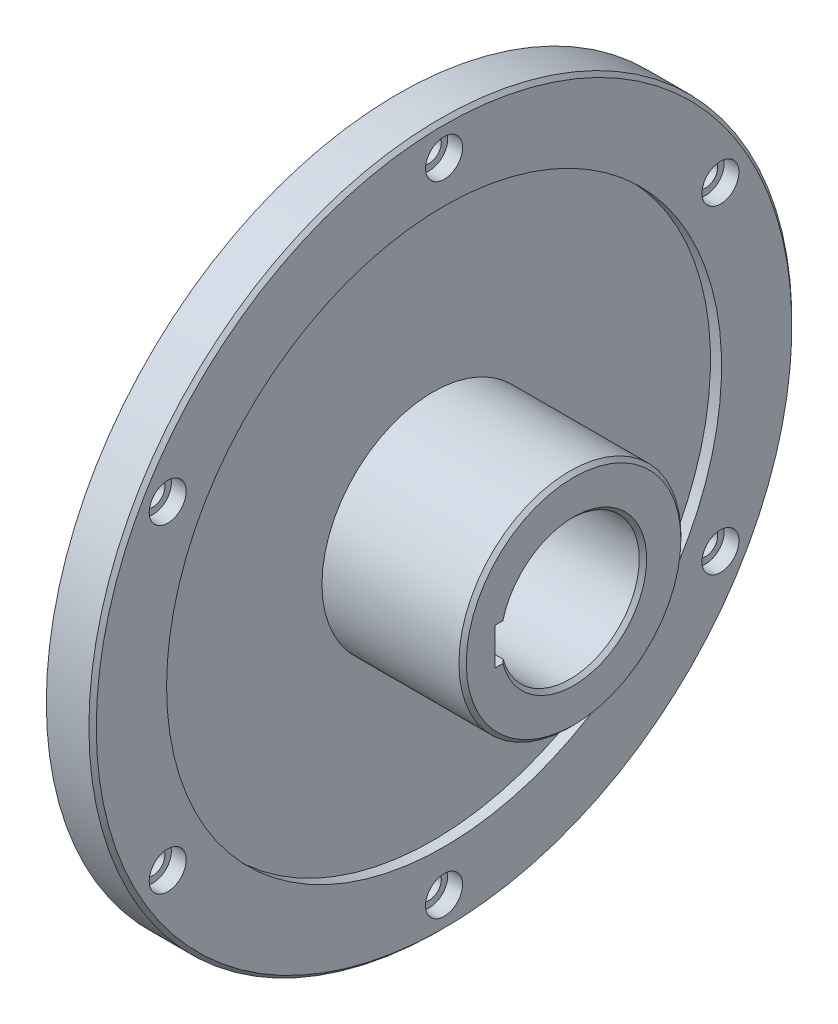
ISO-10303-21;
HEADER;
FILE_DESCRIPTION(('STEP AP214'),'2;1');
FILE_NAME('part.step','',(''),(''),'','','');
FILE_SCHEMA(('AUTOMOTIVE_DESIGN { 1 0 10303 214 1 1 1 1 }'));
ENDSEC;
DATA;
#1=APPLICATION_CONTEXT('core data for automotive mechanical design processes');
#2=APPLICATION_PROTOCOL_DEFINITION('international standard','automotive_design',2000,#1);
#3=PRODUCT_CONTEXT('',#1,'mechanical');
#4=PRODUCT('Part','Part','',(#3));
#5=PRODUCT_RELATED_PRODUCT_CATEGORY('part','',(#4));
#6=PRODUCT_DEFINITION_FORMATION('','',#4);
#7=PRODUCT_DEFINITION_CONTEXT('part definition',#1,'design');
#8=PRODUCT_DEFINITION('design','',#6,#7);
#9=PRODUCT_DEFINITION_SHAPE('','',#8);
#10=(LENGTH_UNIT() NAMED_UNIT(*) SI_UNIT(.MILLI.,.METRE.));
#11=(NAMED_UNIT(*) PLANE_ANGLE_UNIT() SI_UNIT($,.RADIAN.));
#12=(NAMED_UNIT(*) SI_UNIT($,.STERADIAN.) SOLID_ANGLE_UNIT());
#13=UNCERTAINTY_MEASURE_WITH_UNIT(LENGTH_MEASURE(1.E-05),#10,'distance_accuracy_value','');
#14=(GEOMETRIC_REPRESENTATION_CONTEXT(3) GLOBAL_UNCERTAINTY_ASSIGNED_CONTEXT((#13)) GLOBAL_UNIT_ASSIGNED_CONTEXT((#10,
#11,#12)) REPRESENTATION_CONTEXT('',''));
#15=CARTESIAN_POINT('',(0.,0.,0.));
#16=DIRECTION('',(0.,0.,1.));
#17=DIRECTION('',(1.,0.,0.));
#18=AXIS2_PLACEMENT_3D('',#15,#16,#17);
#19=CARTESIAN_POINT('',(-127.420307677469,0.,0.));
#20=DIRECTION('',(-1.,0.,0.));
#21=DIRECTION('',(0.,0.,1.));
#22=AXIS2_PLACEMENT_3D('',#19,#20,#21);
#23=CYLINDRICAL_SURFACE('',#22,150.);
#24=CARTESIAN_POINT('',(-16.039279513889,0.,0.));
#25=DIRECTION('',(1.,0.,0.));
#26=DIRECTION('',(0.,0.,-1.));
#27=AXIS2_PLACEMENT_3D('',#24,#25,#26);
#28=CIRCLE('',#27,150.);
#29=CARTESIAN_POINT('',(-16.039279513889,0.,-150.));
#30=VERTEX_POINT('',#29);
#31=EDGE_CURVE('E11',#30,#30,#28,.T.);
#32=ORIENTED_EDGE('',*,*,#31,.T.);
#33=EDGE_LOOP('',(#32));
#34=FACE_BOUND('',#33,.T.);
#35=CARTESIAN_POINT('',(-13.039279513889,0.,0.));
#36=DIRECTION('',(-1.,0.,0.));
#37=DIRECTION('',(0.,0.,1.));
#38=AXIS2_PLACEMENT_3D('',#35,#36,#37);
#39=CIRCLE('',#38,150.);
#40=CARTESIAN_POINT('',(-13.039279513889,0.,150.));
#41=VERTEX_POINT('',#40);
#42=EDGE_CURVE('E130',#41,#41,#39,.T.);
#43=ORIENTED_EDGE('',*,*,#42,.T.);
#44=EDGE_LOOP('',(#43));
#45=FACE_BOUND('',#44,.T.);
#46=ADVANCED_FACE('F36',(#34,#45),#23,.T.);
#47=CARTESIAN_POINT('',(-18.039279513889,135.,0.));
#48=DIRECTION('',(1.,0.,0.));
#49=DIRECTION('',(0.,0.,-1.));
#50=AXIS2_PLACEMENT_3D('',#47,#48,#49);
#51=PLANE('',#50);
#52=CARTESIAN_POINT('',(-18.039279513889,0.,0.));
#53=DIRECTION('',(1.,0.,0.));
#54=DIRECTION('',(0.,0.,-1.));
#55=AXIS2_PLACEMENT_3D('',#52,#53,#54);
#56=CIRCLE('',#55,148.);
#57=CARTESIAN_POINT('',(-18.039279513889,0.,-148.));
#58=VERTEX_POINT('',#57);
#59=EDGE_CURVE('E45',#58,#58,#56,.F.);
#60=ORIENTED_EDGE('',*,*,#59,.T.);
#61=EDGE_LOOP('',(#60));
#62=FACE_BOUND('',#61,.T.);
#63=CARTESIAN_POINT('',(-18.039279513889,0.,0.));
#64=DIRECTION('',(-1.,0.,0.));
#65=DIRECTION('',(0.,0.,1.));
#66=AXIS2_PLACEMENT_3D('',#63,#64,#65);
#67=CIRCLE('',#66,135.);
#68=CARTESIAN_POINT('',(-18.039279513889,0.,135.));
#69=VERTEX_POINT('',#68);
#70=EDGE_CURVE('E151',#69,#69,#67,.T.);
#71=ORIENTED_EDGE('',*,*,#70,.F.);
#72=EDGE_LOOP('',(#71));
#73=FACE_BOUND('',#72,.T.);
#74=ADVANCED_FACE('F269',(#62,#73),#51,.F.);
#75=CARTESIAN_POINT('',(-127.420307677469,0.,0.));
#76=DIRECTION('',(-1.,0.,0.));
#77=DIRECTION('',(0.,0.,1.));
#78=AXIS2_PLACEMENT_3D('',#75,#76,#77);
#79=CYLINDRICAL_SURFACE('',#78,135.);
#80=CARTESIAN_POINT('',(-12.039279513889,0.,0.));
#81=DIRECTION('',(-1.,0.,0.));
#82=DIRECTION('',(0.,0.,1.));
#83=AXIS2_PLACEMENT_3D('',#80,#81,#82);
#84=CIRCLE('',#83,135.);
#85=CARTESIAN_POINT('',(-12.039279513889,0.,135.));
#86=VERTEX_POINT('',#85);
#87=EDGE_CURVE('E148',#86,#86,#84,.T.);
#88=ORIENTED_EDGE('',*,*,#87,.F.);
#89=EDGE_LOOP('',(#88));
#90=FACE_BOUND('',#89,.T.);
#91=ORIENTED_EDGE('',*,*,#70,.T.);
#92=EDGE_LOOP('',(#91));
#93=FACE_BOUND('',#92,.T.);
#94=ADVANCED_FACE('F275',(#90,#93),#79,.F.);
#95=CARTESIAN_POINT('',(-12.039279513889,135.,0.));
#96=DIRECTION('',(1.,0.,0.));
#97=DIRECTION('',(0.,0.,-1.));
#98=AXIS2_PLACEMENT_3D('',#95,#96,#97);
#99=PLANE('',#98);
#100=CARTESIAN_POINT('',(-12.039279513889,0.,0.));
#101=DIRECTION('',(-1.,0.,0.));
#102=DIRECTION('',(0.,0.,1.));
#103=AXIS2_PLACEMENT_3D('',#100,#101,#102);
#104=CIRCLE('',#103,60.);
#105=CARTESIAN_POINT('',(-12.039279513889,0.,60.));
#106=VERTEX_POINT('',#105);
#107=EDGE_CURVE('E145',#106,#106,#104,.T.);
#108=ORIENTED_EDGE('',*,*,#107,.F.);
#109=EDGE_LOOP('',(#108));
#110=FACE_BOUND('',#109,.T.);
#111=ORIENTED_EDGE('',*,*,#87,.T.);
#112=EDGE_LOOP('',(#111));
#113=FACE_BOUND('',#112,.T.);
#114=ADVANCED_FACE('F577',(#110,#113),#99,.F.);
#115=CARTESIAN_POINT('',(-127.420307677469,0.,0.));
#116=DIRECTION('',(-1.,0.,0.));
#117=DIRECTION('',(0.,0.,1.));
#118=AXIS2_PLACEMENT_3D('',#115,#116,#117);
#119=CYLINDRICAL_SURFACE('',#118,60.);
#120=CARTESIAN_POINT('',(-16.039279513889,0.,0.));
#121=DIRECTION('',(1.,0.,0.));
#122=DIRECTION('',(0.,0.,-1.));
#123=AXIS2_PLACEMENT_3D('',#120,#121,#122);
#124=CIRCLE('',#123,60.);
#125=CARTESIAN_POINT('',(-16.039279513889,0.,-60.));
#126=VERTEX_POINT('',#125);
#127=EDGE_CURVE('E189',#126,#126,#124,.T.);
#128=ORIENTED_EDGE('',*,*,#127,.T.);
#129=EDGE_LOOP('',(#128));
#130=FACE_BOUND('',#129,.T.);
#131=ORIENTED_EDGE('',*,*,#107,.T.);
#132=EDGE_LOOP('',(#131));
#133=FACE_BOUND('',#132,.T.);
#134=ADVANCED_FACE('F571',(#130,#133),#119,.T.);
#135=CARTESIAN_POINT('',(-18.039279513889,60.,0.));
#136=DIRECTION('',(1.,0.,0.));
#137=DIRECTION('',(0.,0.,-1.));
#138=AXIS2_PLACEMENT_3D('',#135,#136,#137);
#139=PLANE('',#138);
#140=CARTESIAN_POINT('',(-18.039279513889,0.,0.));
#141=DIRECTION('',(1.,0.,0.));
#142=DIRECTION('',(0.,0.,-1.));
#143=AXIS2_PLACEMENT_3D('',#140,#141,#142);
#144=CIRCLE('',#143,58.);
#145=CARTESIAN_POINT('',(-18.039279513889,0.,-58.));
#146=VERTEX_POINT('',#145);
#147=EDGE_CURVE('E186',#146,#146,#144,.F.);
#148=ORIENTED_EDGE('',*,*,#147,.T.);
#149=EDGE_LOOP('',(#148));
#150=FACE_BOUND('',#149,.T.);
#151=DIRECTION('',(0.,0.,-1.));
#152=VECTOR('',#151,1.);
#153=CARTESIAN_POINT('',(-18.039279513889,-9.99999999999999,42.4));
#154=LINE('',#153,#152);
#155=CARTESIAN_POINT('',(-18.039279513889,-9.99999999999999,42.4));
#156=VERTEX_POINT('',#155);
#157=CARTESIAN_POINT('',(-18.039279513889,-9.99999999999999,38.2132176085711));
#158=VERTEX_POINT('',#157);
#159=EDGE_CURVE('E98',#156,#158,#154,.T.);
#160=ORIENTED_EDGE('',*,*,#159,.T.);
#161=CARTESIAN_POINT('',(-18.039279513889,0.,0.));
#162=DIRECTION('',(1.,0.,0.));
#163=DIRECTION('',(0.,0.,-1.));
#164=AXIS2_PLACEMENT_3D('',#161,#162,#163);
#165=CIRCLE('',#164,39.5000000000001);
#166=CARTESIAN_POINT('',(-18.039279513889,9.99999999999999,38.2132176085711));
#167=VERTEX_POINT('',#166);
#168=EDGE_CURVE('E184',#158,#167,#165,.T.);
#169=ORIENTED_EDGE('',*,*,#168,.T.);
#170=DIRECTION('',(0.,0.,1.));
#171=VECTOR('',#170,1.);
#172=CARTESIAN_POINT('',(-18.039279513889,10.,0.));
#173=LINE('',#172,#171);
#174=CARTESIAN_POINT('',(-18.039279513889,9.99999999999999,42.4));
#175=VERTEX_POINT('',#174);
#176=EDGE_CURVE('E118',#167,#175,#173,.T.);
#177=ORIENTED_EDGE('',*,*,#176,.T.);
#178=DIRECTION('',(0.,-1.,0.));
#179=VECTOR('',#178,1.);
#180=CARTESIAN_POINT('',(-18.039279513889,9.99999999999999,42.4));
#181=LINE('',#180,#179);
#182=EDGE_CURVE('E120',#175,#156,#181,.T.);
#183=ORIENTED_EDGE('',*,*,#182,.T.);
#184=EDGE_LOOP('',(#160,#169,#177,#183));
#185=FACE_BOUND('',#184,.T.);
#186=ADVANCED_FACE('F576',(#150,#185),#139,.F.);
#187=CARTESIAN_POINT('',(-127.420307677469,0.,0.));
#188=DIRECTION('',(-1.,0.,0.));
#189=DIRECTION('',(0.,0.,1.));
#190=AXIS2_PLACEMENT_3D('',#187,#188,#189);
#191=CYLINDRICAL_SURFACE('',#190,37.5);
#192=DIRECTION('',(-1.,0.,0.));
#193=VECTOR('',#192,1.);
#194=CARTESIAN_POINT('',(-127.420307677469,-9.99999999999999,36.1420807370024));
#195=LINE('',#194,#193);
#196=CARTESIAN_POINT('',(-16.0392795138889,-9.99999999999999,36.1420807370024));
#197=VERTEX_POINT('',#196);
#198=CARTESIAN_POINT('',(79.960720486111,-9.99999999999999,36.1420807370024));
#199=VERTEX_POINT('',#198);
#200=EDGE_CURVE('E102',#197,#199,#195,.F.);
#201=ORIENTED_EDGE('',*,*,#200,.T.);
#202=CARTESIAN_POINT('',(79.960720486111,0.,0.));
#203=DIRECTION('',(-1.,0.,0.));
#204=DIRECTION('',(0.,0.,1.));
#205=AXIS2_PLACEMENT_3D('',#202,#203,#204);
#206=CIRCLE('',#205,37.5);
#207=CARTESIAN_POINT('',(79.960720486111,9.99999999999999,36.1420807370024));
#208=VERTEX_POINT('',#207);
#209=EDGE_CURVE('E59',#199,#208,#206,.F.);
#210=ORIENTED_EDGE('',*,*,#209,.T.);
#211=DIRECTION('',(-1.,0.,0.));
#212=VECTOR('',#211,1.);
#213=CARTESIAN_POINT('',(-127.420307677469,9.99999999999999,36.1420807370024));
#214=LINE('',#213,#212);
#215=CARTESIAN_POINT('',(-16.0392795138889,9.99999999999999,36.1420807370024));
#216=VERTEX_POINT('',#215);
#217=EDGE_CURVE('E128',#208,#216,#214,.T.);
#218=ORIENTED_EDGE('',*,*,#217,.T.);
#219=CARTESIAN_POINT('',(-16.0392795138889,0.,0.));
#220=DIRECTION('',(1.,0.,0.));
#221=DIRECTION('',(0.,0.,-1.));
#222=AXIS2_PLACEMENT_3D('',#219,#220,#221);
#223=CIRCLE('',#222,37.5);
#224=EDGE_CURVE('E755',#216,#197,#223,.F.);
#225=ORIENTED_EDGE('',*,*,#224,.T.);
#226=EDGE_LOOP('',(#201,#210,#218,#225));
#227=FACE_BOUND('',#226,.T.);
#228=ADVANCED_FACE('F589',(#227),#191,.F.);
#229=CARTESIAN_POINT('',(81.960720486111,60.,0.));
#230=DIRECTION('',(-1.,0.,0.));
#231=DIRECTION('',(0.,0.,1.));
#232=AXIS2_PLACEMENT_3D('',#229,#230,#231);
#233=PLANE('',#232);
#234=CARTESIAN_POINT('',(81.960720486111,0.,0.));
#235=DIRECTION('',(-1.,0.,0.));
#236=DIRECTION('',(0.,0.,1.));
#237=AXIS2_PLACEMENT_3D('',#234,#235,#236);
#238=CIRCLE('',#237,58.);
#239=CARTESIAN_POINT('',(81.960720486111,0.,58.));
#240=VERTEX_POINT('',#239);
#241=EDGE_CURVE('E192',#240,#240,#238,.F.);
#242=ORIENTED_EDGE('',*,*,#241,.T.);
#243=EDGE_LOOP('',(#242));
#244=FACE_BOUND('',#243,.T.);
#245=DIRECTION('',(0.,0.,-1.));
#246=VECTOR('',#245,1.);
#247=CARTESIAN_POINT('',(81.960720486111,10.,0.));
#248=LINE('',#247,#246);
#249=CARTESIAN_POINT('',(81.960720486111,9.99999999999999,42.4));
#250=VERTEX_POINT('',#249);
#251=CARTESIAN_POINT('',(81.960720486111,10.,38.213217608571));
#252=VERTEX_POINT('',#251);
#253=EDGE_CURVE('E154',#250,#252,#248,.T.);
#254=ORIENTED_EDGE('',*,*,#253,.T.);
#255=CARTESIAN_POINT('',(81.960720486111,0.,0.));
#256=DIRECTION('',(-1.,0.,0.));
#257=DIRECTION('',(0.,0.,1.));
#258=AXIS2_PLACEMENT_3D('',#255,#256,#257);
#259=CIRCLE('',#258,39.5);
#260=CARTESIAN_POINT('',(81.9607204861111,-9.99999999999999,38.213217608571));
#261=VERTEX_POINT('',#260);
#262=EDGE_CURVE('E117',#252,#261,#259,.T.);
#263=ORIENTED_EDGE('',*,*,#262,.T.);
#264=DIRECTION('',(0.,0.,-1.));
#265=VECTOR('',#264,1.);
#266=CARTESIAN_POINT('',(81.9607204861111,-9.99999999999999,42.4));
#267=LINE('',#266,#265);
#268=CARTESIAN_POINT('',(81.9607204861111,-9.99999999999999,42.4));
#269=VERTEX_POINT('',#268);
#270=EDGE_CURVE('E96',#269,#261,#267,.T.);
#271=ORIENTED_EDGE('',*,*,#270,.F.);
#272=DIRECTION('',(0.,-1.,0.));
#273=VECTOR('',#272,1.);
#274=CARTESIAN_POINT('',(81.9607204861111,9.99999999999999,42.4));
#275=LINE('',#274,#273);
#276=EDGE_CURVE('E106',#250,#269,#275,.T.);
#277=ORIENTED_EDGE('',*,*,#276,.F.);
#278=EDGE_LOOP('',(#254,#263,#271,#277));
#279=FACE_BOUND('',#278,.T.);
#280=ADVANCED_FACE('F115',(#244,#279),#233,.F.);
#281=CARTESIAN_POINT('',(-127.420307677469,0.,0.));
#282=DIRECTION('',(-1.,0.,0.));
#283=DIRECTION('',(0.,0.,1.));
#284=AXIS2_PLACEMENT_3D('',#281,#282,#283);
#285=CYLINDRICAL_SURFACE('',#284,60.);
#286=CARTESIAN_POINT('',(79.9607204861111,0.,0.));
#287=DIRECTION('',(-1.,0.,0.));
#288=DIRECTION('',(0.,0.,1.));
#289=AXIS2_PLACEMENT_3D('',#286,#287,#288);
#290=CIRCLE('',#289,60.);
#291=CARTESIAN_POINT('',(79.9607204861111,0.,60.));
#292=VERTEX_POINT('',#291);
#293=EDGE_CURVE('E243',#292,#292,#290,.T.);
#294=ORIENTED_EDGE('',*,*,#293,.T.);
#295=EDGE_LOOP('',(#294));
#296=FACE_BOUND('',#295,.T.);
#297=CARTESIAN_POINT('',(5.96072048611104,0.,0.));
#298=DIRECTION('',(-1.,0.,0.));
#299=DIRECTION('',(0.,0.,1.));
#300=AXIS2_PLACEMENT_3D('',#297,#298,#299);
#301=CIRCLE('',#300,60.);
#302=CARTESIAN_POINT('',(5.96072048611104,0.,60.));
#303=VERTEX_POINT('',#302);
#304=EDGE_CURVE('E142',#303,#303,#301,.T.);
#305=ORIENTED_EDGE('',*,*,#304,.F.);
#306=EDGE_LOOP('',(#305));
#307=FACE_BOUND('',#306,.T.);
#308=ADVANCED_FACE('F607',(#296,#307),#285,.T.);
#309=CARTESIAN_POINT('',(5.96072048611103,150.,0.));
#310=DIRECTION('',(-1.,0.,0.));
#311=DIRECTION('',(0.,0.,1.));
#312=AXIS2_PLACEMENT_3D('',#309,#310,#311);
#313=PLANE('',#312);
#314=CARTESIAN_POINT('',(5.96072048611101,0.,0.));
#315=DIRECTION('',(-1.,0.,0.));
#316=DIRECTION('',(0.,0.,1.));
#317=AXIS2_PLACEMENT_3D('',#314,#315,#316);
#318=CIRCLE('',#317,150.);
#319=CARTESIAN_POINT('',(5.96072048611101,0.,150.));
#320=VERTEX_POINT('',#319);
#321=EDGE_CURVE('E139',#320,#320,#318,.T.);
#322=ORIENTED_EDGE('',*,*,#321,.F.);
#323=EDGE_LOOP('',(#322));
#324=FACE_BOUND('',#323,.T.);
#325=ORIENTED_EDGE('',*,*,#304,.T.);
#326=EDGE_LOOP('',(#325));
#327=FACE_BOUND('',#326,.T.);
#328=ADVANCED_FACE('F617',(#324,#327),#313,.F.);
#329=CARTESIAN_POINT('',(-127.420307677469,0.,0.));
#330=DIRECTION('',(-1.,0.,0.));
#331=DIRECTION('',(0.,0.,1.));
#332=AXIS2_PLACEMENT_3D('',#329,#330,#331);
#333=CYLINDRICAL_SURFACE('',#332,150.);
#334=CARTESIAN_POINT('',(11.960720486111,0.,0.));
#335=DIRECTION('',(-1.,0.,0.));
#336=DIRECTION('',(0.,0.,1.));
#337=AXIS2_PLACEMENT_3D('',#334,#335,#336);
#338=CIRCLE('',#337,150.);
#339=CARTESIAN_POINT('',(11.960720486111,0.,150.));
#340=VERTEX_POINT('',#339);
#341=EDGE_CURVE('E136',#340,#340,#338,.T.);
#342=ORIENTED_EDGE('',*,*,#341,.F.);
#343=EDGE_LOOP('',(#342));
#344=FACE_BOUND('',#343,.T.);
#345=ORIENTED_EDGE('',*,*,#321,.T.);
#346=EDGE_LOOP('',(#345));
#347=FACE_BOUND('',#346,.T.);
#348=ADVANCED_FACE('F629',(#344,#347),#333,.F.);
#349=CARTESIAN_POINT('',(11.960720486111,190.,0.));
#350=DIRECTION('',(-1.,0.,0.));
#351=DIRECTION('',(0.,0.,1.));
#352=AXIS2_PLACEMENT_3D('',#349,#350,#351);
#353=PLANE('',#352);
#354=CARTESIAN_POINT('',(11.960720486111,0.,0.));
#355=DIRECTION('',(-1.,0.,0.));
#356=DIRECTION('',(0.,0.,1.));
#357=AXIS2_PLACEMENT_3D('',#354,#355,#356);
#358=CIRCLE('',#357,188.);
#359=CARTESIAN_POINT('',(11.960720486111,0.,188.));
#360=VERTEX_POINT('',#359);
#361=EDGE_CURVE('E181',#360,#360,#358,.F.);
#362=ORIENTED_EDGE('',*,*,#361,.T.);
#363=EDGE_LOOP('',(#362));
#364=FACE_BOUND('',#363,.T.);
#365=CARTESIAN_POINT('',(11.960720486111,-86.2500000000017,-149.389382152815));
#366=DIRECTION('',(-1.,0.,0.));
#367=DIRECTION('',(0.,0.,1.));
#368=AXIS2_PLACEMENT_3D('',#365,#366,#367);
#369=CIRCLE('',#368,10.);
#370=CARTESIAN_POINT('',(11.960720486111,-86.2500000000017,-139.389382152815));
#371=VERTEX_POINT('',#370);
#372=EDGE_CURVE('E178',#371,#371,#369,.T.);
#373=ORIENTED_EDGE('',*,*,#372,.T.);
#374=EDGE_LOOP('',(#373));
#375=FACE_BOUND('',#374,.T.);
#376=CARTESIAN_POINT('',(11.960720486111,86.2499999999986,-149.389382152816));
#377=DIRECTION('',(-1.,0.,0.));
#378=DIRECTION('',(0.,0.,1.));
#379=AXIS2_PLACEMENT_3D('',#376,#377,#378);
#380=CIRCLE('',#379,10.);
#381=CARTESIAN_POINT('',(11.960720486111,86.2499999999986,-139.389382152816));
#382=VERTEX_POINT('',#381);
#383=EDGE_CURVE('E423',#382,#382,#380,.T.);
#384=ORIENTED_EDGE('',*,*,#383,.T.);
#385=EDGE_LOOP('',(#384));
#386=FACE_BOUND('',#385,.T.);
#387=CARTESIAN_POINT('',(11.960720486111,172.5,0.));
#388=DIRECTION('',(-1.,0.,0.));
#389=DIRECTION('',(0.,0.,1.));
#390=AXIS2_PLACEMENT_3D('',#387,#388,#389);
#391=CIRCLE('',#390,10.);
#392=CARTESIAN_POINT('',(11.960720486111,172.5,10.));
#393=VERTEX_POINT('',#392);
#394=EDGE_CURVE('E417',#393,#393,#391,.T.);
#395=ORIENTED_EDGE('',*,*,#394,.T.);
#396=EDGE_LOOP('',(#395));
#397=FACE_BOUND('',#396,.T.);
#398=CARTESIAN_POINT('',(11.960720486111,86.2500000000007,149.389382152815));
#399=DIRECTION('',(-1.,0.,0.));
#400=DIRECTION('',(0.,0.,1.));
#401=AXIS2_PLACEMENT_3D('',#398,#399,#400);
#402=CIRCLE('',#401,10.);
#403=CARTESIAN_POINT('',(11.960720486111,86.2500000000007,159.389382152815));
#404=VERTEX_POINT('',#403);
#405=EDGE_CURVE('E411',#404,#404,#402,.T.);
#406=ORIENTED_EDGE('',*,*,#405,.T.);
#407=EDGE_LOOP('',(#406));
#408=FACE_BOUND('',#407,.T.);
#409=CARTESIAN_POINT('',(11.960720486111,-86.2499999999996,149.389382152816));
#410=DIRECTION('',(-1.,0.,0.));
#411=DIRECTION('',(0.,0.,1.));
#412=AXIS2_PLACEMENT_3D('',#409,#410,#411);
#413=CIRCLE('',#412,10.);
#414=CARTESIAN_POINT('',(11.960720486111,-86.2499999999996,159.389382152816));
#415=VERTEX_POINT('',#414);
#416=EDGE_CURVE('E410',#415,#415,#413,.T.);
#417=ORIENTED_EDGE('',*,*,#416,.T.);
#418=EDGE_LOOP('',(#417));
#419=FACE_BOUND('',#418,.T.);
#420=CARTESIAN_POINT('',(11.960720486111,-172.5,0.));
#421=DIRECTION('',(-1.,0.,0.));
#422=DIRECTION('',(0.,0.,1.));
#423=AXIS2_PLACEMENT_3D('',#420,#421,#422);
#424=CIRCLE('',#423,10.);
#425=CARTESIAN_POINT('',(11.960720486111,-172.5,10.));
#426=VERTEX_POINT('',#425);
#427=EDGE_CURVE('E160',#426,#426,#424,.T.);
#428=ORIENTED_EDGE('',*,*,#427,.T.);
#429=EDGE_LOOP('',(#428));
#430=FACE_BOUND('',#429,.T.);
#431=ORIENTED_EDGE('',*,*,#341,.T.);
#432=EDGE_LOOP('',(#431));
#433=FACE_BOUND('',#432,.T.);
#434=ADVANCED_FACE('F302',(#364,#375,#386,#397,#408,#419,#430,#433),#353,.F.);
#435=CARTESIAN_POINT('',(-127.420307677469,0.,0.));
#436=DIRECTION('',(-1.,0.,0.));
#437=DIRECTION('',(0.,0.,1.));
#438=AXIS2_PLACEMENT_3D('',#435,#436,#437);
#439=CYLINDRICAL_SURFACE('',#438,190.);
#440=CARTESIAN_POINT('',(9.96072048611116,0.,0.));
#441=DIRECTION('',(-1.,0.,0.));
#442=DIRECTION('',(0.,0.,1.));
#443=AXIS2_PLACEMENT_3D('',#440,#441,#442);
#444=CIRCLE('',#443,190.);
#445=CARTESIAN_POINT('',(9.96072048611116,0.,190.));
#446=VERTEX_POINT('',#445);
#447=EDGE_CURVE('E156',#446,#446,#444,.T.);
#448=ORIENTED_EDGE('',*,*,#447,.T.);
#449=EDGE_LOOP('',(#448));
#450=FACE_BOUND('',#449,.T.);
#451=CARTESIAN_POINT('',(-13.039279513889,0.,0.));
#452=DIRECTION('',(-1.,0.,0.));
#453=DIRECTION('',(0.,0.,1.));
#454=AXIS2_PLACEMENT_3D('',#451,#452,#453);
#455=CIRCLE('',#454,190.);
#456=CARTESIAN_POINT('',(-13.039279513889,0.,190.));
#457=VERTEX_POINT('',#456);
#458=EDGE_CURVE('E133',#457,#457,#455,.T.);
#459=ORIENTED_EDGE('',*,*,#458,.F.);
#460=EDGE_LOOP('',(#459));
#461=FACE_BOUND('',#460,.T.);
#462=ADVANCED_FACE('F299',(#450,#461),#439,.T.);
#463=CARTESIAN_POINT('',(-13.039279513889,150.,0.));
#464=DIRECTION('',(1.,0.,0.));
#465=DIRECTION('',(0.,0.,-1.));
#466=AXIS2_PLACEMENT_3D('',#463,#464,#465);
#467=PLANE('',#466);
#468=CARTESIAN_POINT('',(-13.039279513889,-86.2500000000017,-149.389382152815));
#469=DIRECTION('',(1.,0.,0.));
#470=DIRECTION('',(0.,0.,-1.));
#471=AXIS2_PLACEMENT_3D('',#468,#469,#470);
#472=CIRCLE('',#471,6.5);
#473=CARTESIAN_POINT('',(-13.039279513889,-86.2500000000017,-155.889382152815));
#474=VERTEX_POINT('',#473);
#475=EDGE_CURVE('E175',#474,#474,#472,.T.);
#476=ORIENTED_EDGE('',*,*,#475,.T.);
#477=EDGE_LOOP('',(#476));
#478=FACE_BOUND('',#477,.T.);
#479=CARTESIAN_POINT('',(-13.039279513889,86.2499999999986,-149.389382152816));
#480=DIRECTION('',(1.,0.,0.));
#481=DIRECTION('',(0.,0.,-1.));
#482=AXIS2_PLACEMENT_3D('',#479,#480,#481);
#483=CIRCLE('',#482,6.5);
#484=CARTESIAN_POINT('',(-13.039279513889,86.2499999999986,-155.889382152816));
#485=VERTEX_POINT('',#484);
#486=EDGE_CURVE('E172',#485,#485,#483,.T.);
#487=ORIENTED_EDGE('',*,*,#486,.T.);
#488=EDGE_LOOP('',(#487));
#489=FACE_BOUND('',#488,.T.);
#490=CARTESIAN_POINT('',(-13.039279513889,172.5,0.));
#491=DIRECTION('',(1.,0.,0.));
#492=DIRECTION('',(0.,0.,-1.));
#493=AXIS2_PLACEMENT_3D('',#490,#491,#492);
#494=CIRCLE('',#493,6.5);
#495=CARTESIAN_POINT('',(-13.039279513889,172.5,-6.5));
#496=VERTEX_POINT('',#495);
#497=EDGE_CURVE('E169',#496,#496,#494,.T.);
#498=ORIENTED_EDGE('',*,*,#497,.T.);
#499=EDGE_LOOP('',(#498));
#500=FACE_BOUND('',#499,.T.);
#501=CARTESIAN_POINT('',(-13.039279513889,86.2500000000007,149.389382152815));
#502=DIRECTION('',(1.,0.,0.));
#503=DIRECTION('',(0.,0.,-1.));
#504=AXIS2_PLACEMENT_3D('',#501,#502,#503);
#505=CIRCLE('',#504,6.5);
#506=CARTESIAN_POINT('',(-13.039279513889,86.2500000000007,142.889382152815));
#507=VERTEX_POINT('',#506);
#508=EDGE_CURVE('E165',#507,#507,#505,.T.);
#509=ORIENTED_EDGE('',*,*,#508,.T.);
#510=EDGE_LOOP('',(#509));
#511=FACE_BOUND('',#510,.T.);
#512=CARTESIAN_POINT('',(-13.039279513889,-86.2499999999996,149.389382152816));
#513=DIRECTION('',(1.,0.,0.));
#514=DIRECTION('',(0.,0.,-1.));
#515=AXIS2_PLACEMENT_3D('',#512,#513,#514);
#516=CIRCLE('',#515,6.5);
#517=CARTESIAN_POINT('',(-13.039279513889,-86.2499999999996,142.889382152816));
#518=VERTEX_POINT('',#517);
#519=EDGE_CURVE('E162',#518,#518,#516,.T.);
#520=ORIENTED_EDGE('',*,*,#519,.T.);
#521=EDGE_LOOP('',(#520));
#522=FACE_BOUND('',#521,.T.);
#523=CARTESIAN_POINT('',(-13.039279513889,-172.5,0.));
#524=DIRECTION('',(1.,0.,0.));
#525=DIRECTION('',(0.,0.,-1.));
#526=AXIS2_PLACEMENT_3D('',#523,#524,#525);
#527=CIRCLE('',#526,6.5);
#528=CARTESIAN_POINT('',(-13.039279513889,-172.5,-6.5));
#529=VERTEX_POINT('',#528);
#530=EDGE_CURVE('E157',#529,#529,#527,.T.);
#531=ORIENTED_EDGE('',*,*,#530,.T.);
#532=EDGE_LOOP('',(#531));
#533=FACE_BOUND('',#532,.T.);
#534=ORIENTED_EDGE('',*,*,#42,.F.);
#535=EDGE_LOOP('',(#534));
#536=FACE_BOUND('',#535,.T.);
#537=ORIENTED_EDGE('',*,*,#458,.T.);
#538=EDGE_LOOP('',(#537));
#539=FACE_BOUND('',#538,.T.);
#540=ADVANCED_FACE('F227',(#478,#489,#500,#511,#522,#533,#536,#539),#467,.F.);
#541=CARTESIAN_POINT('',(-18.039279513889,10.,0.));
#542=DIRECTION('',(0.,1.,0.));
#543=DIRECTION('',(0.,0.,1.));
#544=AXIS2_PLACEMENT_3D('',#541,#542,#543);
#545=PLANE('',#544);
#546=ORIENTED_EDGE('',*,*,#217,.F.);
#547=CARTESIAN_POINT('',(79.960720486111,10.,36.1420807370024));
#548=CARTESIAN_POINT('',(80.2937294426869,9.99999999999999,36.4875834548844));
#549=CARTESIAN_POINT('',(80.6269005885981,9.99999999999999,36.8329295541116));
#550=CARTESIAN_POINT('',(81.2935672552685,9.99999999999999,37.5233085112976));
#551=CARTESIAN_POINT('',(81.6270627760239,9.99999999999999,37.8683413692599));
#552=CARTESIAN_POINT('',(81.960720486111,9.99999999999999,38.213217608571));
#553=B_SPLINE_CURVE_WITH_KNOTS('',3,(#547,#548,#549,#550,#551,#552),.UNSPECIFIED.,.F.,.F.,(4,2,
4),(0.,1.43958412969624,2.8791682428825),.UNSPECIFIED.);
#554=EDGE_CURVE('E237',#208,#252,#553,.T.);
#555=ORIENTED_EDGE('',*,*,#554,.T.);
#556=ORIENTED_EDGE('',*,*,#253,.F.);
#557=DIRECTION('',(1.,0.,0.));
#558=VECTOR('',#557,1.);
#559=CARTESIAN_POINT('',(-18.039279513889,9.99999999999999,42.4));
#560=LINE('',#559,#558);
#561=EDGE_CURVE('E103',#175,#250,#560,.T.);
#562=ORIENTED_EDGE('',*,*,#561,.F.);
#563=ORIENTED_EDGE('',*,*,#176,.F.);
#564=CARTESIAN_POINT('',(-18.039279513889,9.99999999999999,38.2132176085711));
#565=CARTESIAN_POINT('',(-17.7056218038019,9.99999999999999,37.86834136926));
#566=CARTESIAN_POINT('',(-17.3721262830464,9.99999999999999,37.5233085112976));
#567=CARTESIAN_POINT('',(-16.705459616376,9.99999999999999,36.8329295541117));
#568=CARTESIAN_POINT('',(-16.3722884704647,9.99999999999999,36.4875834548844));
#569=CARTESIAN_POINT('',(-16.0392795138889,9.99999999999999,36.1420807370024));
#570=B_SPLINE_CURVE_WITH_KNOTS('',3,(#564,#565,#566,#567,#568,#569),.UNSPECIFIED.,.F.,.F.,(4,2,
4),(0.,1.43958411318634,2.87916824288265),.UNSPECIFIED.);
#571=EDGE_CURVE('E52',#167,#216,#570,.T.);
#572=ORIENTED_EDGE('',*,*,#571,.T.);
#573=EDGE_LOOP('',(#546,#555,#556,#562,#563,#572));
#574=FACE_BOUND('',#573,.T.);
#575=ADVANCED_FACE('F218',(#574),#545,.F.);
#576=CARTESIAN_POINT('',(-18.039279513889,-9.99999999999999,42.4));
#577=DIRECTION('',(0.,-1.,0.));
#578=DIRECTION('',(0.,0.,-1.));
#579=AXIS2_PLACEMENT_3D('',#576,#577,#578);
#580=PLANE('',#579);
#581=ORIENTED_EDGE('',*,*,#270,.T.);
#582=CARTESIAN_POINT('',(81.960720486111,-10.,38.213217608571));
#583=CARTESIAN_POINT('',(81.6270627760239,-10.,37.8683413692599));
#584=CARTESIAN_POINT('',(81.2935672552685,-9.99999999999999,37.5233085112976));
#585=CARTESIAN_POINT('',(80.6269005885981,-9.99999999999999,36.8329295541116));
#586=CARTESIAN_POINT('',(80.2937294426869,-9.99999999999999,36.4875834548844));
#587=CARTESIAN_POINT('',(79.960720486111,-9.99999999999999,36.1420807370024));
#588=B_SPLINE_CURVE_WITH_KNOTS('',3,(#582,#583,#584,#585,#586,#587),.UNSPECIFIED.,.F.,.F.,(4,2,
4),(0.,1.43958411318626,2.87916824288251),.UNSPECIFIED.);
#589=EDGE_CURVE('E203',#261,#199,#588,.T.);
#590=ORIENTED_EDGE('',*,*,#589,.T.);
#591=ORIENTED_EDGE('',*,*,#200,.F.);
#592=CARTESIAN_POINT('',(-16.0392795138889,-10.,36.1420807370024));
#593=CARTESIAN_POINT('',(-16.3722884704647,-9.99999999999999,36.4875834548844));
#594=CARTESIAN_POINT('',(-16.705459616376,-9.99999999999999,36.8329295541117));
#595=CARTESIAN_POINT('',(-17.3721262830464,-9.99999999999999,37.5233085112976));
#596=CARTESIAN_POINT('',(-17.7056218038019,-9.99999999999999,37.86834136926));
#597=CARTESIAN_POINT('',(-18.039279513889,-9.99999999999999,38.2132176085711));
#598=B_SPLINE_CURVE_WITH_KNOTS('',3,(#592,#593,#594,#595,#596,#597),.UNSPECIFIED.,.F.,.F.,(4,2,
4),(0.,1.43958412969631,2.87916824288265),.UNSPECIFIED.);
#599=EDGE_CURVE('E196',#197,#158,#598,.T.);
#600=ORIENTED_EDGE('',*,*,#599,.T.);
#601=ORIENTED_EDGE('',*,*,#159,.F.);
#602=DIRECTION('',(1.,0.,0.));
#603=VECTOR('',#602,1.);
#604=CARTESIAN_POINT('',(-18.039279513889,-9.99999999999999,42.4));
#605=LINE('',#604,#603);
#606=EDGE_CURVE('E92',#156,#269,#605,.T.);
#607=ORIENTED_EDGE('',*,*,#606,.T.);
#608=EDGE_LOOP('',(#581,#590,#591,#600,#601,#607));
#609=FACE_BOUND('',#608,.T.);
#610=ADVANCED_FACE('F94',(#609),#580,.F.);
#611=CARTESIAN_POINT('',(-18.039279513889,9.99999999999999,42.4));
#612=DIRECTION('',(0.,0.,1.));
#613=DIRECTION('',(1.,0.,0.));
#614=AXIS2_PLACEMENT_3D('',#611,#612,#613);
#615=PLANE('',#614);
#616=ORIENTED_EDGE('',*,*,#606,.F.);
#617=ORIENTED_EDGE('',*,*,#182,.F.);
#618=ORIENTED_EDGE('',*,*,#561,.T.);
#619=ORIENTED_EDGE('',*,*,#276,.T.);
#620=EDGE_LOOP('',(#616,#617,#618,#619));
#621=FACE_BOUND('',#620,.T.);
#622=ADVANCED_FACE('F107',(#621),#615,.F.);
#623=CARTESIAN_POINT('',(3.96072048611104,-172.5,0.));
#624=DIRECTION('',(1.,0.,0.));
#625=DIRECTION('',(0.,0.,-1.));
#626=AXIS2_PLACEMENT_3D('',#623,#624,#625);
#627=CYLINDRICAL_SURFACE('',#626,10.);
#628=CARTESIAN_POINT('',(3.96072048611104,-172.5,0.));
#629=DIRECTION('',(-1.,0.,0.));
#630=DIRECTION('',(0.,0.,1.));
#631=AXIS2_PLACEMENT_3D('',#628,#629,#630);
#632=CIRCLE('',#631,10.);
#633=CARTESIAN_POINT('',(3.96072048611104,-172.5,10.));
#634=VERTEX_POINT('',#633);
#635=EDGE_CURVE('E112',#634,#634,#632,.T.);
#636=ORIENTED_EDGE('',*,*,#635,.T.);
#637=EDGE_LOOP('',(#636));
#638=FACE_BOUND('',#637,.T.);
#639=ORIENTED_EDGE('',*,*,#427,.F.);
#640=EDGE_LOOP('',(#639));
#641=FACE_BOUND('',#640,.T.);
#642=ADVANCED_FACE('F219',(#638,#641),#627,.F.);
#643=CARTESIAN_POINT('',(3.96072048611104,-172.5,0.));
#644=DIRECTION('',(-1.,0.,0.));
#645=DIRECTION('',(0.,0.,1.));
#646=AXIS2_PLACEMENT_3D('',#643,#644,#645);
#647=PLANE('',#646);
#648=CARTESIAN_POINT('',(3.96072048611104,-172.5,0.));
#649=DIRECTION('',(1.,0.,0.));
#650=DIRECTION('',(0.,0.,-1.));
#651=AXIS2_PLACEMENT_3D('',#648,#649,#650);
#652=CIRCLE('',#651,6.5);
#653=CARTESIAN_POINT('',(3.96072048611104,-172.5,-6.5));
#654=VERTEX_POINT('',#653);
#655=EDGE_CURVE('E161',#654,#654,#652,.T.);
#656=ORIENTED_EDGE('',*,*,#655,.F.);
#657=EDGE_LOOP('',(#656));
#658=FACE_BOUND('',#657,.T.);
#659=ORIENTED_EDGE('',*,*,#635,.F.);
#660=EDGE_LOOP('',(#659));
#661=FACE_BOUND('',#660,.T.);
#662=ADVANCED_FACE('F326',(#658,#661),#647,.F.);
#663=CARTESIAN_POINT('',(-18.039279513889,-172.5,0.));
#664=DIRECTION('',(1.,0.,0.));
#665=DIRECTION('',(0.,0.,-1.));
#666=AXIS2_PLACEMENT_3D('',#663,#664,#665);
#667=CYLINDRICAL_SURFACE('',#666,6.5);
#668=ORIENTED_EDGE('',*,*,#655,.T.);
#669=EDGE_LOOP('',(#668));
#670=FACE_BOUND('',#669,.T.);
#671=ORIENTED_EDGE('',*,*,#530,.F.);
#672=EDGE_LOOP('',(#671));
#673=FACE_BOUND('',#672,.T.);
#674=ADVANCED_FACE('F323',(#670,#673),#667,.F.);
#675=CARTESIAN_POINT('',(3.96072048611104,-86.2499999999996,149.389382152816));
#676=DIRECTION('',(1.,0.,0.));
#677=DIRECTION('',(0.,0.,-1.));
#678=AXIS2_PLACEMENT_3D('',#675,#676,#677);
#679=CYLINDRICAL_SURFACE('',#678,10.);
#680=CARTESIAN_POINT('',(3.96072048611104,-86.2499999999996,149.389382152816));
#681=DIRECTION('',(-1.,0.,0.));
#682=DIRECTION('',(0.,0.,1.));
#683=AXIS2_PLACEMENT_3D('',#680,#681,#682);
#684=CIRCLE('',#683,10.);
#685=CARTESIAN_POINT('',(3.96072048611104,-86.2499999999996,159.389382152816));
#686=VERTEX_POINT('',#685);
#687=EDGE_CURVE('E431',#686,#686,#684,.T.);
#688=ORIENTED_EDGE('',*,*,#687,.T.);
#689=EDGE_LOOP('',(#688));
#690=FACE_BOUND('',#689,.T.);
#691=ORIENTED_EDGE('',*,*,#416,.F.);
#692=EDGE_LOOP('',(#691));
#693=FACE_BOUND('',#692,.T.);
#694=ADVANCED_FACE('F325',(#690,#693),#679,.F.);
#695=CARTESIAN_POINT('',(3.96072048611104,-86.2499999999996,149.389382152816));
#696=DIRECTION('',(-1.,0.,0.));
#697=DIRECTION('',(0.,0.,1.));
#698=AXIS2_PLACEMENT_3D('',#695,#696,#697);
#699=PLANE('',#698);
#700=CARTESIAN_POINT('',(3.96072048611104,-86.2499999999996,149.389382152816));
#701=DIRECTION('',(1.,0.,0.));
#702=DIRECTION('',(0.,-0.86602540378444,-0.499999999999998));
#703=AXIS2_PLACEMENT_3D('',#700,#701,#702);
#704=CIRCLE('',#703,6.5);
#705=CARTESIAN_POINT('',(3.96072048611104,-91.8791651245985,146.139382152816));
#706=VERTEX_POINT('',#705);
#707=EDGE_CURVE('E166',#706,#706,#704,.T.);
#708=ORIENTED_EDGE('',*,*,#707,.F.);
#709=EDGE_LOOP('',(#708));
#710=FACE_BOUND('',#709,.T.);
#711=ORIENTED_EDGE('',*,*,#687,.F.);
#712=EDGE_LOOP('',(#711));
#713=FACE_BOUND('',#712,.T.);
#714=ADVANCED_FACE('F333',(#710,#713),#699,.F.);
#715=CARTESIAN_POINT('',(3.96072048611104,86.2500000000007,149.389382152815));
#716=DIRECTION('',(1.,0.,0.));
#717=DIRECTION('',(0.,0.,-1.));
#718=AXIS2_PLACEMENT_3D('',#715,#716,#717);
#719=CYLINDRICAL_SURFACE('',#718,10.);
#720=CARTESIAN_POINT('',(3.96072048611104,86.2500000000007,149.389382152815));
#721=DIRECTION('',(-1.,0.,0.));
#722=DIRECTION('',(0.,0.,1.));
#723=AXIS2_PLACEMENT_3D('',#720,#721,#722);
#724=CIRCLE('',#723,10.);
#725=CARTESIAN_POINT('',(3.96072048611104,86.2500000000007,159.389382152815));
#726=VERTEX_POINT('',#725);
#727=EDGE_CURVE('E407',#726,#726,#724,.T.);
#728=ORIENTED_EDGE('',*,*,#727,.T.);
#729=EDGE_LOOP('',(#728));
#730=FACE_BOUND('',#729,.T.);
#731=ORIENTED_EDGE('',*,*,#405,.F.);
#732=EDGE_LOOP('',(#731));
#733=FACE_BOUND('',#732,.T.);
#734=ADVANCED_FACE('F341',(#730,#733),#719,.F.);
#735=CARTESIAN_POINT('',(3.96072048611104,86.2500000000007,149.389382152815));
#736=DIRECTION('',(-1.,0.,0.));
#737=DIRECTION('',(0.,0.,1.));
#738=AXIS2_PLACEMENT_3D('',#735,#736,#737);
#739=PLANE('',#738);
#740=CARTESIAN_POINT('',(3.96072048611104,86.2500000000007,149.389382152815));
#741=DIRECTION('',(1.,0.,0.));
#742=DIRECTION('',(0.,-0.866025403784436,0.500000000000004));
#743=AXIS2_PLACEMENT_3D('',#740,#741,#742);
#744=CIRCLE('',#743,6.5);
#745=CARTESIAN_POINT('',(3.96072048611104,80.6208348754019,152.639382152815));
#746=VERTEX_POINT('',#745);
#747=EDGE_CURVE('E393',#746,#746,#744,.T.);
#748=ORIENTED_EDGE('',*,*,#747,.F.);
#749=EDGE_LOOP('',(#748));
#750=FACE_BOUND('',#749,.T.);
#751=ORIENTED_EDGE('',*,*,#727,.F.);
#752=EDGE_LOOP('',(#751));
#753=FACE_BOUND('',#752,.T.);
#754=ADVANCED_FACE('F364',(#750,#753),#739,.F.);
#755=CARTESIAN_POINT('',(3.96072048611104,172.5,0.));
#756=DIRECTION('',(1.,0.,0.));
#757=DIRECTION('',(0.,0.,-1.));
#758=AXIS2_PLACEMENT_3D('',#755,#756,#757);
#759=CYLINDRICAL_SURFACE('',#758,10.);
#760=CARTESIAN_POINT('',(3.96072048611104,172.5,0.));
#761=DIRECTION('',(-1.,0.,0.));
#762=DIRECTION('',(0.,0.,1.));
#763=AXIS2_PLACEMENT_3D('',#760,#761,#762);
#764=CIRCLE('',#763,10.);
#765=CARTESIAN_POINT('',(3.96072048611104,172.5,10.));
#766=VERTEX_POINT('',#765);
#767=EDGE_CURVE('E414',#766,#766,#764,.T.);
#768=ORIENTED_EDGE('',*,*,#767,.T.);
#769=EDGE_LOOP('',(#768));
#770=FACE_BOUND('',#769,.T.);
#771=ORIENTED_EDGE('',*,*,#394,.F.);
#772=EDGE_LOOP('',(#771));
#773=FACE_BOUND('',#772,.T.);
#774=ADVANCED_FACE('F361',(#770,#773),#759,.F.);
#775=CARTESIAN_POINT('',(3.96072048611104,172.5,0.));
#776=DIRECTION('',(-1.,0.,0.));
#777=DIRECTION('',(0.,0.,1.));
#778=AXIS2_PLACEMENT_3D('',#775,#776,#777);
#779=PLANE('',#778);
#780=CARTESIAN_POINT('',(3.96072048611104,172.5,0.));
#781=DIRECTION('',(1.,0.,0.));
#782=DIRECTION('',(0.,0.,1.));
#783=AXIS2_PLACEMENT_3D('',#780,#781,#782);
#784=CIRCLE('',#783,6.5);
#785=CARTESIAN_POINT('',(3.96072048611104,172.5,6.5));
#786=VERTEX_POINT('',#785);
#787=EDGE_CURVE('E394',#786,#786,#784,.T.);
#788=ORIENTED_EDGE('',*,*,#787,.F.);
#789=EDGE_LOOP('',(#788));
#790=FACE_BOUND('',#789,.T.);
#791=ORIENTED_EDGE('',*,*,#767,.F.);
#792=EDGE_LOOP('',(#791));
#793=FACE_BOUND('',#792,.T.);
#794=ADVANCED_FACE('F356',(#790,#793),#779,.F.);
#795=CARTESIAN_POINT('',(3.96072048611104,86.2499999999986,-149.389382152816));
#796=DIRECTION('',(1.,0.,0.));
#797=DIRECTION('',(0.,0.,-1.));
#798=AXIS2_PLACEMENT_3D('',#795,#796,#797);
#799=CYLINDRICAL_SURFACE('',#798,10.);
#800=CARTESIAN_POINT('',(3.96072048611104,86.2499999999986,-149.389382152816));
#801=DIRECTION('',(-1.,0.,0.));
#802=DIRECTION('',(0.,0.,1.));
#803=AXIS2_PLACEMENT_3D('',#800,#801,#802);
#804=CIRCLE('',#803,10.);
#805=CARTESIAN_POINT('',(3.96072048611104,86.2499999999986,-139.389382152816));
#806=VERTEX_POINT('',#805);
#807=EDGE_CURVE('E420',#806,#806,#804,.T.);
#808=ORIENTED_EDGE('',*,*,#807,.T.);
#809=EDGE_LOOP('',(#808));
#810=FACE_BOUND('',#809,.T.);
#811=ORIENTED_EDGE('',*,*,#383,.F.);
#812=EDGE_LOOP('',(#811));
#813=FACE_BOUND('',#812,.T.);
#814=ADVANCED_FACE('F353',(#810,#813),#799,.F.);
#815=CARTESIAN_POINT('',(3.96072048611104,86.2499999999986,-149.389382152816));
#816=DIRECTION('',(-1.,0.,0.));
#817=DIRECTION('',(0.,0.,1.));
#818=AXIS2_PLACEMENT_3D('',#815,#816,#817);
#819=PLANE('',#818);
#820=CARTESIAN_POINT('',(3.96072048611104,86.2499999999986,-149.389382152816));
#821=DIRECTION('',(1.,0.,0.));
#822=DIRECTION('',(0.,0.866025403784443,0.499999999999992));
#823=AXIS2_PLACEMENT_3D('',#820,#821,#822);
#824=CIRCLE('',#823,6.5);
#825=CARTESIAN_POINT('',(3.96072048611104,91.8791651245975,-146.139382152816));
#826=VERTEX_POINT('',#825);
#827=EDGE_CURVE('E399',#826,#826,#824,.T.);
#828=ORIENTED_EDGE('',*,*,#827,.F.);
#829=EDGE_LOOP('',(#828));
#830=FACE_BOUND('',#829,.T.);
#831=ORIENTED_EDGE('',*,*,#807,.F.);
#832=EDGE_LOOP('',(#831));
#833=FACE_BOUND('',#832,.T.);
#834=ADVANCED_FACE('F347',(#830,#833),#819,.F.);
#835=CARTESIAN_POINT('',(3.96072048611104,-86.2500000000017,-149.389382152815));
#836=DIRECTION('',(1.,0.,0.));
#837=DIRECTION('',(0.,0.,-1.));
#838=AXIS2_PLACEMENT_3D('',#835,#836,#837);
#839=CYLINDRICAL_SURFACE('',#838,10.);
#840=CARTESIAN_POINT('',(3.96072048611104,-86.2500000000017,-149.389382152815));
#841=DIRECTION('',(-1.,0.,0.));
#842=DIRECTION('',(0.,0.,1.));
#843=AXIS2_PLACEMENT_3D('',#840,#841,#842);
#844=CIRCLE('',#843,10.);
#845=CARTESIAN_POINT('',(3.96072048611104,-86.2500000000017,-139.389382152815));
#846=VERTEX_POINT('',#845);
#847=EDGE_CURVE('E426',#846,#846,#844,.T.);
#848=ORIENTED_EDGE('',*,*,#847,.T.);
#849=EDGE_LOOP('',(#848));
#850=FACE_BOUND('',#849,.T.);
#851=ORIENTED_EDGE('',*,*,#372,.F.);
#852=EDGE_LOOP('',(#851));
#853=FACE_BOUND('',#852,.T.);
#854=ADVANCED_FACE('F343',(#850,#853),#839,.F.);
#855=CARTESIAN_POINT('',(3.96072048611104,-86.2500000000017,-149.389382152815));
#856=DIRECTION('',(-1.,0.,0.));
#857=DIRECTION('',(0.,0.,1.));
#858=AXIS2_PLACEMENT_3D('',#855,#856,#857);
#859=PLANE('',#858);
#860=CARTESIAN_POINT('',(3.96072048611104,-86.2500000000017,-149.389382152815));
#861=DIRECTION('',(1.,0.,0.));
#862=DIRECTION('',(0.,0.866025403784433,-0.50000000000001));
#863=AXIS2_PLACEMENT_3D('',#860,#861,#862);
#864=CIRCLE('',#863,6.5);
#865=CARTESIAN_POINT('',(3.96072048611104,-80.6208348754029,-152.639382152815));
#866=VERTEX_POINT('',#865);
#867=EDGE_CURVE('E404',#866,#866,#864,.T.);
#868=ORIENTED_EDGE('',*,*,#867,.F.);
#869=EDGE_LOOP('',(#868));
#870=FACE_BOUND('',#869,.T.);
#871=ORIENTED_EDGE('',*,*,#847,.F.);
#872=EDGE_LOOP('',(#871));
#873=FACE_BOUND('',#872,.T.);
#874=ADVANCED_FACE('F346',(#870,#873),#859,.F.);
#875=CARTESIAN_POINT('',(-18.039279513889,-86.2499999999996,149.389382152816));
#876=DIRECTION('',(1.,0.,0.));
#877=DIRECTION('',(0.,0.,-1.));
#878=AXIS2_PLACEMENT_3D('',#875,#876,#877);
#879=CYLINDRICAL_SURFACE('',#878,6.5);
#880=ORIENTED_EDGE('',*,*,#707,.T.);
#881=EDGE_LOOP('',(#880));
#882=FACE_BOUND('',#881,.T.);
#883=ORIENTED_EDGE('',*,*,#519,.F.);
#884=EDGE_LOOP('',(#883));
#885=FACE_BOUND('',#884,.T.);
#886=ADVANCED_FACE('F351',(#882,#885),#879,.F.);
#887=CARTESIAN_POINT('',(-18.039279513889,86.2500000000007,149.389382152815));
#888=DIRECTION('',(1.,0.,0.));
#889=DIRECTION('',(0.,0.,-1.));
#890=AXIS2_PLACEMENT_3D('',#887,#888,#889);
#891=CYLINDRICAL_SURFACE('',#890,6.5);
#892=ORIENTED_EDGE('',*,*,#747,.T.);
#893=EDGE_LOOP('',(#892));
#894=FACE_BOUND('',#893,.T.);
#895=ORIENTED_EDGE('',*,*,#508,.F.);
#896=EDGE_LOOP('',(#895));
#897=FACE_BOUND('',#896,.T.);
#898=ADVANCED_FACE('F376',(#894,#897),#891,.F.);
#899=CARTESIAN_POINT('',(-18.039279513889,172.5,0.));
#900=DIRECTION('',(1.,0.,0.));
#901=DIRECTION('',(0.,0.,-1.));
#902=AXIS2_PLACEMENT_3D('',#899,#900,#901);
#903=CYLINDRICAL_SURFACE('',#902,6.5);
#904=ORIENTED_EDGE('',*,*,#787,.T.);
#905=EDGE_LOOP('',(#904));
#906=FACE_BOUND('',#905,.T.);
#907=ORIENTED_EDGE('',*,*,#497,.F.);
#908=EDGE_LOOP('',(#907));
#909=FACE_BOUND('',#908,.T.);
#910=ADVANCED_FACE('F381',(#906,#909),#903,.F.);
#911=CARTESIAN_POINT('',(-18.039279513889,86.2499999999986,-149.389382152816));
#912=DIRECTION('',(1.,0.,0.));
#913=DIRECTION('',(0.,0.,-1.));
#914=AXIS2_PLACEMENT_3D('',#911,#912,#913);
#915=CYLINDRICAL_SURFACE('',#914,6.5);
#916=ORIENTED_EDGE('',*,*,#827,.T.);
#917=EDGE_LOOP('',(#916));
#918=FACE_BOUND('',#917,.T.);
#919=ORIENTED_EDGE('',*,*,#486,.F.);
#920=EDGE_LOOP('',(#919));
#921=FACE_BOUND('',#920,.T.);
#922=ADVANCED_FACE('F292',(#918,#921),#915,.F.);
#923=CARTESIAN_POINT('',(-18.039279513889,-86.2500000000017,-149.389382152815));
#924=DIRECTION('',(1.,0.,0.));
#925=DIRECTION('',(0.,0.,-1.));
#926=AXIS2_PLACEMENT_3D('',#923,#924,#925);
#927=CYLINDRICAL_SURFACE('',#926,6.5);
#928=ORIENTED_EDGE('',*,*,#867,.T.);
#929=EDGE_LOOP('',(#928));
#930=FACE_BOUND('',#929,.T.);
#931=ORIENTED_EDGE('',*,*,#475,.F.);
#932=EDGE_LOOP('',(#931));
#933=FACE_BOUND('',#932,.T.);
#934=ADVANCED_FACE('F285',(#930,#933),#927,.F.);
#935=CARTESIAN_POINT('',(9.96072048611116,0.,0.));
#936=DIRECTION('',(-1.,0.,0.));
#937=DIRECTION('',(0.,0.,1.));
#938=AXIS2_PLACEMENT_3D('',#935,#936,#937);
#939=CONICAL_SURFACE('',#938,190.,0.785398163397455);
#940=ORIENTED_EDGE('',*,*,#361,.F.);
#941=EDGE_LOOP('',(#940));
#942=FACE_BOUND('',#941,.T.);
#943=ORIENTED_EDGE('',*,*,#447,.F.);
#944=EDGE_LOOP('',(#943));
#945=FACE_BOUND('',#944,.T.);
#946=ADVANCED_FACE('F281',(#942,#945),#939,.T.);
#947=CARTESIAN_POINT('',(-18.039279513889,0.,0.));
#948=DIRECTION('',(1.,0.,0.));
#949=DIRECTION('',(0.,0.,-1.));
#950=AXIS2_PLACEMENT_3D('',#947,#948,#949);
#951=CONICAL_SURFACE('',#950,58.,0.785398163397453);
#952=ORIENTED_EDGE('',*,*,#127,.F.);
#953=EDGE_LOOP('',(#952));
#954=FACE_BOUND('',#953,.T.);
#955=ORIENTED_EDGE('',*,*,#147,.F.);
#956=EDGE_LOOP('',(#955));
#957=FACE_BOUND('',#956,.T.);
#958=ADVANCED_FACE('F254',(#954,#957),#951,.T.);
#959=CARTESIAN_POINT('',(81.9607204861111,0.,0.));
#960=DIRECTION('',(1.,0.,0.));
#961=DIRECTION('',(0.,0.,-1.));
#962=AXIS2_PLACEMENT_3D('',#959,#960,#961);
#963=CONICAL_SURFACE('',#962,39.5,0.785398163397429);
#964=ORIENTED_EDGE('',*,*,#554,.F.);
#965=ORIENTED_EDGE('',*,*,#209,.F.);
#966=ORIENTED_EDGE('',*,*,#589,.F.);
#967=ORIENTED_EDGE('',*,*,#262,.F.);
#968=EDGE_LOOP('',(#964,#965,#966,#967));
#969=FACE_BOUND('',#968,.T.);
#970=ADVANCED_FACE('F245',(#969),#963,.F.);
#971=CARTESIAN_POINT('',(79.9607204861111,0.,0.));
#972=DIRECTION('',(-1.,0.,0.));
#973=DIRECTION('',(0.,0.,1.));
#974=AXIS2_PLACEMENT_3D('',#971,#972,#973);
#975=CONICAL_SURFACE('',#974,60.,0.785398163397462);
#976=ORIENTED_EDGE('',*,*,#241,.F.);
#977=EDGE_LOOP('',(#976));
#978=FACE_BOUND('',#977,.T.);
#979=ORIENTED_EDGE('',*,*,#293,.F.);
#980=EDGE_LOOP('',(#979));
#981=FACE_BOUND('',#980,.T.);
#982=ADVANCED_FACE('F253',(#978,#981),#975,.T.);
#983=CARTESIAN_POINT('',(-16.0392795138889,0.,0.));
#984=DIRECTION('',(-1.,0.,0.));
#985=DIRECTION('',(0.,0.,1.));
#986=AXIS2_PLACEMENT_3D('',#983,#984,#985);
#987=CONICAL_SURFACE('',#986,37.5,0.785398163397443);
#988=ORIENTED_EDGE('',*,*,#571,.F.);
#989=ORIENTED_EDGE('',*,*,#168,.F.);
#990=ORIENTED_EDGE('',*,*,#599,.F.);
#991=ORIENTED_EDGE('',*,*,#224,.F.);
#992=EDGE_LOOP('',(#988,#989,#990,#991));
#993=FACE_BOUND('',#992,.T.);
#994=ADVANCED_FACE('F211',(#993),#987,.F.);
#995=CARTESIAN_POINT('',(-18.039279513889,0.,0.));
#996=DIRECTION('',(1.,0.,0.));
#997=DIRECTION('',(0.,0.,-1.));
#998=AXIS2_PLACEMENT_3D('',#995,#996,#997);
#999=CONICAL_SURFACE('',#998,148.,0.785398163397435);
#1000=ORIENTED_EDGE('',*,*,#31,.F.);
#1001=EDGE_LOOP('',(#1000));
#1002=FACE_BOUND('',#1001,.T.);
#1003=ORIENTED_EDGE('',*,*,#59,.F.);
#1004=EDGE_LOOP('',(#1003));
#1005=FACE_BOUND('',#1004,.T.);
#1006=ADVANCED_FACE('F39',(#1002,#1005),#999,.T.);
#1007=CLOSED_SHELL('',(#46,#74,#94,#114,#134,#186,#228,#280,#308,#328,#348,#434,#462,#540,#575,
#610,#622,#642,#662,#674,#694,#714,#734,#754,#774,#794,#814,#834,#854,#874,#886,#898,#910,#922,
#934,#946,#958,#970,#982,#994,#1006));
#1008=MANIFOLD_SOLID_BREP('B2',#1007);
#1009=ADVANCED_BREP_SHAPE_REPRESENTATION('',(#18,#1008),#14);
#1010=SHAPE_DEFINITION_REPRESENTATION(#9,#1009);
ENDSEC;
END-ISO-10303-21;
